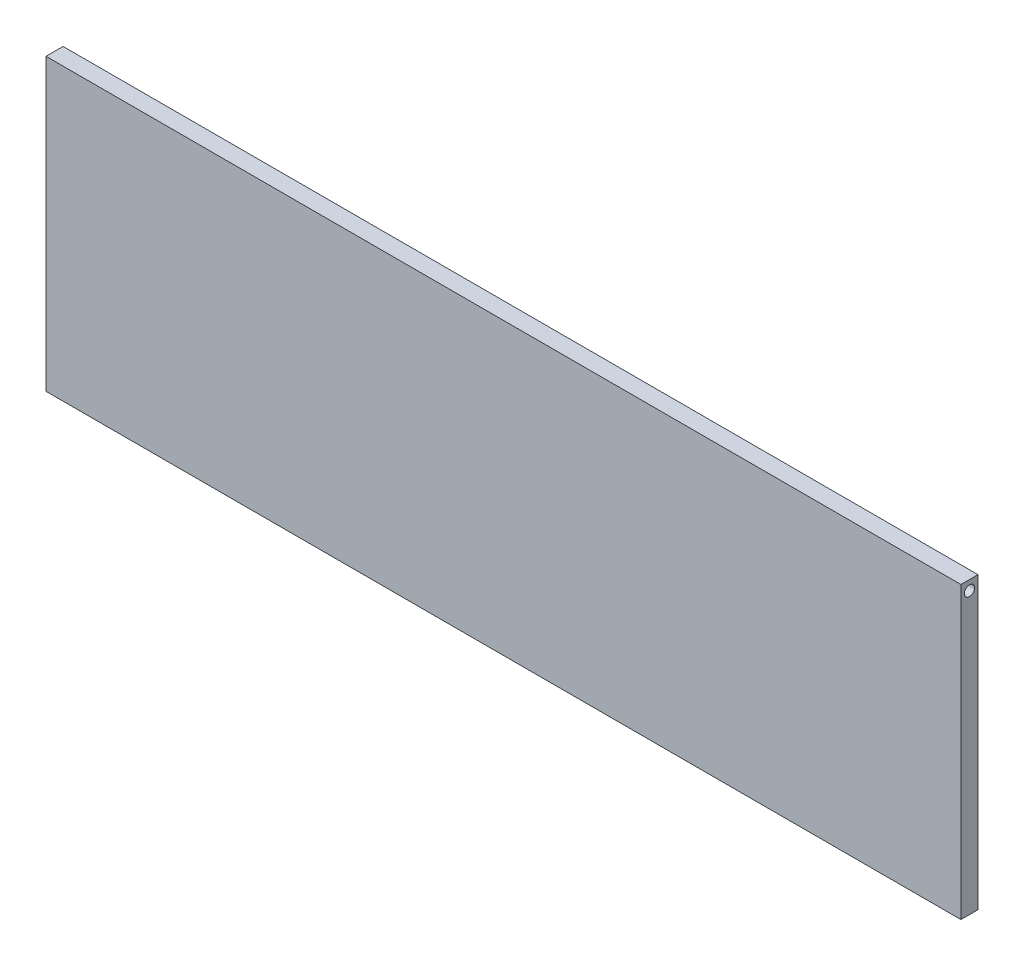
ISO-10303-21;
HEADER;
FILE_DESCRIPTION(('STEP AP214'),'2;1');
FILE_NAME('part.step','',(''),(''),'','','');
FILE_SCHEMA(('AUTOMOTIVE_DESIGN { 1 0 10303 214 1 1 1 1 }'));
ENDSEC;
DATA;
#1=APPLICATION_CONTEXT('core data for automotive mechanical design processes');
#2=APPLICATION_PROTOCOL_DEFINITION('international standard','automotive_design',2000,#1);
#3=PRODUCT_CONTEXT('',#1,'mechanical');
#4=PRODUCT('Part','Part','',(#3));
#5=PRODUCT_RELATED_PRODUCT_CATEGORY('part','',(#4));
#6=PRODUCT_DEFINITION_FORMATION('','',#4);
#7=PRODUCT_DEFINITION_CONTEXT('part definition',#1,'design');
#8=PRODUCT_DEFINITION('design','',#6,#7);
#9=PRODUCT_DEFINITION_SHAPE('','',#8);
#10=(LENGTH_UNIT() NAMED_UNIT(*) SI_UNIT(.MILLI.,.METRE.));
#11=(NAMED_UNIT(*) PLANE_ANGLE_UNIT() SI_UNIT($,.RADIAN.));
#12=(NAMED_UNIT(*) SI_UNIT($,.STERADIAN.) SOLID_ANGLE_UNIT());
#13=UNCERTAINTY_MEASURE_WITH_UNIT(LENGTH_MEASURE(1.E-05),#10,'distance_accuracy_value','');
#14=(GEOMETRIC_REPRESENTATION_CONTEXT(3) GLOBAL_UNCERTAINTY_ASSIGNED_CONTEXT((#13)) GLOBAL_UNIT_ASSIGNED_CONTEXT((#10,
#11,#12)) REPRESENTATION_CONTEXT('',''));
#15=CARTESIAN_POINT('',(0.,0.,0.));
#16=DIRECTION('',(0.,0.,1.));
#17=DIRECTION('',(1.,0.,0.));
#18=AXIS2_PLACEMENT_3D('',#15,#16,#17);
#19=CARTESIAN_POINT('',(-161.823834196891,47.2435233160622,5.));
#20=DIRECTION('',(1.,0.,0.));
#21=DIRECTION('',(0.,0.,-1.));
#22=AXIS2_PLACEMENT_3D('',#19,#20,#21);
#23=PLANE('',#22);
#24=CARTESIAN_POINT('',(-161.823834196891,44.4206168613681,2.5));
#25=DIRECTION('',(1.,0.,0.));
#26=DIRECTION('',(0.,0.,-1.));
#27=AXIS2_PLACEMENT_3D('',#24,#25,#26);
#28=CIRCLE('',#27,1.5);
#29=CARTESIAN_POINT('',(-161.823834196891,44.4206168613681,1.));
#30=VERTEX_POINT('',#29);
#31=EDGE_CURVE('E113',#30,#30,#28,.T.);
#32=ORIENTED_EDGE('',*,*,#31,.T.);
#33=EDGE_LOOP('',(#32));
#34=FACE_BOUND('',#33,.T.);
#35=DIRECTION('',(0.,-1.,0.));
#36=VECTOR('',#35,1.);
#37=CARTESIAN_POINT('',(-161.823834196891,47.2435233160622,0.));
#38=LINE('',#37,#36);
#39=CARTESIAN_POINT('',(-161.823834196891,47.2435233160622,0.));
#40=VERTEX_POINT('',#39);
#41=CARTESIAN_POINT('',(-161.823834196891,-37.7564766839378,0.));
#42=VERTEX_POINT('',#41);
#43=EDGE_CURVE('E109',#40,#42,#38,.T.);
#44=ORIENTED_EDGE('',*,*,#43,.T.);
#45=DIRECTION('',(0.,0.,-1.));
#46=VECTOR('',#45,1.);
#47=CARTESIAN_POINT('',(-161.823834196891,-37.7564766839378,5.));
#48=LINE('',#47,#46);
#49=CARTESIAN_POINT('',(-161.823834196891,-37.7564766839378,5.));
#50=VERTEX_POINT('',#49);
#51=EDGE_CURVE('E11',#50,#42,#48,.T.);
#52=ORIENTED_EDGE('',*,*,#51,.F.);
#53=DIRECTION('',(0.,-1.,0.));
#54=VECTOR('',#53,1.);
#55=CARTESIAN_POINT('',(-161.823834196891,47.2435233160622,5.));
#56=LINE('',#55,#54);
#57=CARTESIAN_POINT('',(-161.823834196891,47.2435233160622,5.));
#58=VERTEX_POINT('',#57);
#59=EDGE_CURVE('E93',#58,#50,#56,.T.);
#60=ORIENTED_EDGE('',*,*,#59,.F.);
#61=DIRECTION('',(0.,0.,-1.));
#62=VECTOR('',#61,1.);
#63=CARTESIAN_POINT('',(-161.823834196891,47.2435233160622,5.));
#64=LINE('',#63,#62);
#65=EDGE_CURVE('E105',#58,#40,#64,.T.);
#66=ORIENTED_EDGE('',*,*,#65,.T.);
#67=EDGE_LOOP('',(#44,#52,#60,#66));
#68=FACE_BOUND('',#67,.T.);
#69=ADVANCED_FACE('F41',(#34,#68),#23,.F.);
#70=CARTESIAN_POINT('',(-161.823834196891,-37.7564766839378,5.));
#71=DIRECTION('',(0.,1.,0.));
#72=DIRECTION('',(0.,0.,1.));
#73=AXIS2_PLACEMENT_3D('',#70,#71,#72);
#74=PLANE('',#73);
#75=DIRECTION('',(1.,0.,0.));
#76=VECTOR('',#75,1.);
#77=CARTESIAN_POINT('',(-161.823834196891,-37.7564766839378,0.));
#78=LINE('',#77,#76);
#79=CARTESIAN_POINT('',(106.176165803109,-37.7564766839378,0.));
#80=VERTEX_POINT('',#79);
#81=EDGE_CURVE('E98',#42,#80,#78,.T.);
#82=ORIENTED_EDGE('',*,*,#81,.T.);
#83=DIRECTION('',(0.,0.,-1.));
#84=VECTOR('',#83,1.);
#85=CARTESIAN_POINT('',(106.176165803109,-37.7564766839378,5.));
#86=LINE('',#85,#84);
#87=CARTESIAN_POINT('',(106.176165803109,-37.7564766839378,5.));
#88=VERTEX_POINT('',#87);
#89=EDGE_CURVE('E50',#88,#80,#86,.T.);
#90=ORIENTED_EDGE('',*,*,#89,.F.);
#91=DIRECTION('',(1.,0.,0.));
#92=VECTOR('',#91,1.);
#93=CARTESIAN_POINT('',(-161.823834196891,-37.7564766839378,5.));
#94=LINE('',#93,#92);
#95=EDGE_CURVE('E88',#50,#88,#94,.T.);
#96=ORIENTED_EDGE('',*,*,#95,.F.);
#97=ORIENTED_EDGE('',*,*,#51,.T.);
#98=EDGE_LOOP('',(#82,#90,#96,#97));
#99=FACE_BOUND('',#98,.T.);
#100=ADVANCED_FACE('F97',(#99),#74,.F.);
#101=CARTESIAN_POINT('',(106.176165803109,47.2435233160622,5.));
#102=DIRECTION('',(-1.,0.,0.));
#103=DIRECTION('',(0.,-1.,0.));
#104=AXIS2_PLACEMENT_3D('',#101,#102,#103);
#105=PLANE('',#104);
#106=CARTESIAN_POINT('',(106.176165803109,44.4206168613681,2.5));
#107=DIRECTION('',(1.,0.,0.));
#108=DIRECTION('',(0.,0.,-1.));
#109=AXIS2_PLACEMENT_3D('',#106,#107,#108);
#110=CIRCLE('',#109,1.5);
#111=CARTESIAN_POINT('',(106.176165803109,44.4206168613681,1.));
#112=VERTEX_POINT('',#111);
#113=EDGE_CURVE('E130',#112,#112,#110,.T.);
#114=ORIENTED_EDGE('',*,*,#113,.F.);
#115=EDGE_LOOP('',(#114));
#116=FACE_BOUND('',#115,.T.);
#117=DIRECTION('',(0.,1.,0.));
#118=VECTOR('',#117,1.);
#119=CARTESIAN_POINT('',(106.176165803109,47.2435233160622,0.));
#120=LINE('',#119,#118);
#121=CARTESIAN_POINT('',(106.176165803109,47.2435233160622,0.));
#122=VERTEX_POINT('',#121);
#123=EDGE_CURVE('E75',#80,#122,#120,.T.);
#124=ORIENTED_EDGE('',*,*,#123,.T.);
#125=DIRECTION('',(0.,0.,-1.));
#126=VECTOR('',#125,1.);
#127=CARTESIAN_POINT('',(106.176165803109,47.2435233160622,5.));
#128=LINE('',#127,#126);
#129=CARTESIAN_POINT('',(106.176165803109,47.2435233160622,5.));
#130=VERTEX_POINT('',#129);
#131=EDGE_CURVE('E100',#130,#122,#128,.T.);
#132=ORIENTED_EDGE('',*,*,#131,.F.);
#133=DIRECTION('',(0.,1.,0.));
#134=VECTOR('',#133,1.);
#135=CARTESIAN_POINT('',(106.176165803109,47.2435233160622,5.));
#136=LINE('',#135,#134);
#137=EDGE_CURVE('E91',#88,#130,#136,.T.);
#138=ORIENTED_EDGE('',*,*,#137,.F.);
#139=ORIENTED_EDGE('',*,*,#89,.T.);
#140=EDGE_LOOP('',(#124,#132,#138,#139));
#141=FACE_BOUND('',#140,.T.);
#142=ADVANCED_FACE('F101',(#116,#141),#105,.F.);
#143=CARTESIAN_POINT('',(-161.823834196891,47.2435233160622,5.));
#144=DIRECTION('',(0.,-1.,0.));
#145=DIRECTION('',(0.,0.,-1.));
#146=AXIS2_PLACEMENT_3D('',#143,#144,#145);
#147=PLANE('',#146);
#148=DIRECTION('',(-1.,0.,0.));
#149=VECTOR('',#148,1.);
#150=CARTESIAN_POINT('',(-161.823834196891,47.2435233160622,0.));
#151=LINE('',#150,#149);
#152=EDGE_CURVE('E81',#122,#40,#151,.T.);
#153=ORIENTED_EDGE('',*,*,#152,.T.);
#154=ORIENTED_EDGE('',*,*,#65,.F.);
#155=DIRECTION('',(-1.,0.,0.));
#156=VECTOR('',#155,1.);
#157=CARTESIAN_POINT('',(-161.823834196891,47.2435233160622,5.));
#158=LINE('',#157,#156);
#159=EDGE_CURVE('E58',#130,#58,#158,.T.);
#160=ORIENTED_EDGE('',*,*,#159,.F.);
#161=ORIENTED_EDGE('',*,*,#131,.T.);
#162=EDGE_LOOP('',(#153,#154,#160,#161));
#163=FACE_BOUND('',#162,.T.);
#164=ADVANCED_FACE('F123',(#163),#147,.F.);
#165=CARTESIAN_POINT('',(0.,0.,5.));
#166=DIRECTION('',(0.,0.,1.));
#167=DIRECTION('',(1.,0.,0.));
#168=AXIS2_PLACEMENT_3D('',#165,#166,#167);
#169=PLANE('',#168);
#170=ORIENTED_EDGE('',*,*,#59,.T.);
#171=ORIENTED_EDGE('',*,*,#95,.T.);
#172=ORIENTED_EDGE('',*,*,#137,.T.);
#173=ORIENTED_EDGE('',*,*,#159,.T.);
#174=EDGE_LOOP('',(#170,#171,#172,#173));
#175=FACE_BOUND('',#174,.T.);
#176=ADVANCED_FACE('F89',(#175),#169,.T.);
#177=CARTESIAN_POINT('',(0.,0.,0.));
#178=DIRECTION('',(0.,0.,1.));
#179=DIRECTION('',(1.,0.,0.));
#180=AXIS2_PLACEMENT_3D('',#177,#178,#179);
#181=PLANE('',#180);
#182=ORIENTED_EDGE('',*,*,#43,.F.);
#183=ORIENTED_EDGE('',*,*,#152,.F.);
#184=ORIENTED_EDGE('',*,*,#123,.F.);
#185=ORIENTED_EDGE('',*,*,#81,.F.);
#186=EDGE_LOOP('',(#182,#183,#184,#185));
#187=FACE_BOUND('',#186,.T.);
#188=ADVANCED_FACE('F126',(#187),#181,.F.);
#189=CARTESIAN_POINT('',(-161.823834196891,44.4206168613681,2.5));
#190=DIRECTION('',(1.,0.,0.));
#191=DIRECTION('',(0.,0.,-1.));
#192=AXIS2_PLACEMENT_3D('',#189,#190,#191);
#193=CYLINDRICAL_SURFACE('',#192,1.5);
#194=ORIENTED_EDGE('',*,*,#31,.F.);
#195=EDGE_LOOP('',(#194));
#196=FACE_BOUND('',#195,.T.);
#197=ORIENTED_EDGE('',*,*,#113,.T.);
#198=EDGE_LOOP('',(#197));
#199=FACE_BOUND('',#198,.T.);
#200=ADVANCED_FACE('F139',(#196,#199),#193,.F.);
#201=CLOSED_SHELL('',(#69,#100,#142,#164,#176,#188,#200));
#202=MANIFOLD_SOLID_BREP('B2',#201);
#203=ADVANCED_BREP_SHAPE_REPRESENTATION('',(#18,#202),#14);
#204=SHAPE_DEFINITION_REPRESENTATION(#9,#203);
ENDSEC;
END-ISO-10303-21;
